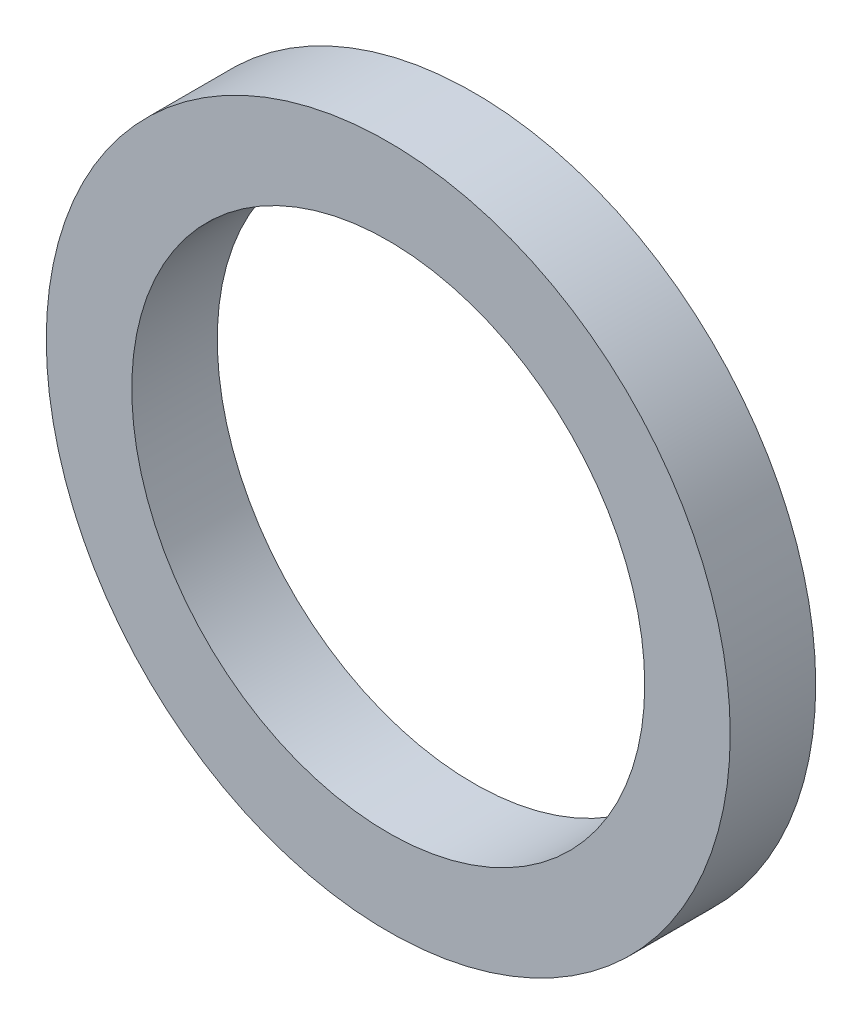
ISO-10303-21;
HEADER;
FILE_DESCRIPTION(('STEP AP214'),'2;1');
FILE_NAME('part.step','',(''),(''),'','','');
FILE_SCHEMA(('AUTOMOTIVE_DESIGN { 1 0 10303 214 1 1 1 1 }'));
ENDSEC;
DATA;
#1=APPLICATION_CONTEXT('core data for automotive mechanical design processes');
#2=APPLICATION_PROTOCOL_DEFINITION('international standard','automotive_design',2000,#1);
#3=PRODUCT_CONTEXT('',#1,'mechanical');
#4=PRODUCT('Part','Part','',(#3));
#5=PRODUCT_RELATED_PRODUCT_CATEGORY('part','',(#4));
#6=PRODUCT_DEFINITION_FORMATION('','',#4);
#7=PRODUCT_DEFINITION_CONTEXT('part definition',#1,'design');
#8=PRODUCT_DEFINITION('design','',#6,#7);
#9=PRODUCT_DEFINITION_SHAPE('','',#8);
#10=(LENGTH_UNIT() NAMED_UNIT(*) SI_UNIT(.MILLI.,.METRE.));
#11=(NAMED_UNIT(*) PLANE_ANGLE_UNIT() SI_UNIT($,.RADIAN.));
#12=(NAMED_UNIT(*) SI_UNIT($,.STERADIAN.) SOLID_ANGLE_UNIT());
#13=UNCERTAINTY_MEASURE_WITH_UNIT(LENGTH_MEASURE(1.E-05),#10,'distance_accuracy_value','');
#14=(GEOMETRIC_REPRESENTATION_CONTEXT(3) GLOBAL_UNCERTAINTY_ASSIGNED_CONTEXT((#13)) GLOBAL_UNIT_ASSIGNED_CONTEXT((#10,
#11,#12)) REPRESENTATION_CONTEXT('',''));
#15=CARTESIAN_POINT('',(0.,0.,0.));
#16=DIRECTION('',(0.,0.,1.));
#17=DIRECTION('',(1.,0.,0.));
#18=AXIS2_PLACEMENT_3D('',#15,#16,#17);
#19=CARTESIAN_POINT('',(0.,0.,0.25));
#20=DIRECTION('',(0.,0.,1.));
#21=DIRECTION('',(1.,0.,0.));
#22=AXIS2_PLACEMENT_3D('',#19,#20,#21);
#23=PLANE('',#22);
#24=CARTESIAN_POINT('',(0.,0.,0.25));
#25=DIRECTION('',(0.,0.,1.));
#26=DIRECTION('',(1.,0.,0.));
#27=AXIS2_PLACEMENT_3D('',#24,#25,#26);
#28=CIRCLE('',#27,2.);
#29=CARTESIAN_POINT('',(2.,0.,0.25));
#30=VERTEX_POINT('',#29);
#31=EDGE_CURVE('E10',#30,#30,#28,.T.);
#32=ORIENTED_EDGE('',*,*,#31,.T.);
#33=EDGE_LOOP('',(#32));
#34=FACE_BOUND('',#33,.T.);
#35=CARTESIAN_POINT('',(0.,0.,0.25));
#36=DIRECTION('',(0.,0.,1.));
#37=DIRECTION('',(1.,0.,0.));
#38=AXIS2_PLACEMENT_3D('',#35,#36,#37);
#39=CIRCLE('',#38,1.5);
#40=CARTESIAN_POINT('',(1.5,0.,0.25));
#41=VERTEX_POINT('',#40);
#42=EDGE_CURVE('E50',#41,#41,#39,.T.);
#43=ORIENTED_EDGE('',*,*,#42,.F.);
#44=EDGE_LOOP('',(#43));
#45=FACE_BOUND('',#44,.T.);
#46=ADVANCED_FACE('F37',(#34,#45),#23,.T.);
#47=CARTESIAN_POINT('',(0.,0.,-0.25));
#48=DIRECTION('',(0.,0.,1.));
#49=DIRECTION('',(1.,0.,0.));
#50=AXIS2_PLACEMENT_3D('',#47,#48,#49);
#51=PLANE('',#50);
#52=CARTESIAN_POINT('',(0.,0.,-0.25));
#53=DIRECTION('',(0.,0.,1.));
#54=DIRECTION('',(1.,0.,0.));
#55=AXIS2_PLACEMENT_3D('',#52,#53,#54);
#56=CIRCLE('',#55,2.);
#57=CARTESIAN_POINT('',(2.,0.,-0.25));
#58=VERTEX_POINT('',#57);
#59=EDGE_CURVE('E41',#58,#58,#56,.T.);
#60=ORIENTED_EDGE('',*,*,#59,.F.);
#61=EDGE_LOOP('',(#60));
#62=FACE_BOUND('',#61,.T.);
#63=CARTESIAN_POINT('',(0.,0.,-0.25));
#64=DIRECTION('',(0.,0.,1.));
#65=DIRECTION('',(1.,0.,0.));
#66=AXIS2_PLACEMENT_3D('',#63,#64,#65);
#67=CIRCLE('',#66,1.5);
#68=CARTESIAN_POINT('',(1.5,0.,-0.25));
#69=VERTEX_POINT('',#68);
#70=EDGE_CURVE('E52',#69,#69,#67,.T.);
#71=ORIENTED_EDGE('',*,*,#70,.T.);
#72=EDGE_LOOP('',(#71));
#73=FACE_BOUND('',#72,.T.);
#74=ADVANCED_FACE('F64',(#62,#73),#51,.F.);
#75=CARTESIAN_POINT('',(0.,0.,0.25));
#76=DIRECTION('',(0.,0.,-1.));
#77=DIRECTION('',(-1.,0.,0.));
#78=AXIS2_PLACEMENT_3D('',#75,#76,#77);
#79=CYLINDRICAL_SURFACE('',#78,2.);
#80=ORIENTED_EDGE('',*,*,#31,.F.);
#81=EDGE_LOOP('',(#80));
#82=FACE_BOUND('',#81,.T.);
#83=ORIENTED_EDGE('',*,*,#59,.T.);
#84=EDGE_LOOP('',(#83));
#85=FACE_BOUND('',#84,.T.);
#86=ADVANCED_FACE('F39',(#82,#85),#79,.T.);
#87=CARTESIAN_POINT('',(0.,0.,0.25));
#88=DIRECTION('',(0.,0.,-1.));
#89=DIRECTION('',(-1.,0.,0.));
#90=AXIS2_PLACEMENT_3D('',#87,#88,#89);
#91=CYLINDRICAL_SURFACE('',#90,1.5);
#92=ORIENTED_EDGE('',*,*,#42,.T.);
#93=EDGE_LOOP('',(#92));
#94=FACE_BOUND('',#93,.T.);
#95=ORIENTED_EDGE('',*,*,#70,.F.);
#96=EDGE_LOOP('',(#95));
#97=FACE_BOUND('',#96,.T.);
#98=ADVANCED_FACE('F60',(#94,#97),#91,.F.);
#99=CLOSED_SHELL('',(#46,#74,#86,#98));
#100=MANIFOLD_SOLID_BREP('B2',#99);
#101=ADVANCED_BREP_SHAPE_REPRESENTATION('',(#18,#100),#14);
#102=SHAPE_DEFINITION_REPRESENTATION(#9,#101);
ENDSEC;
END-ISO-10303-21;
